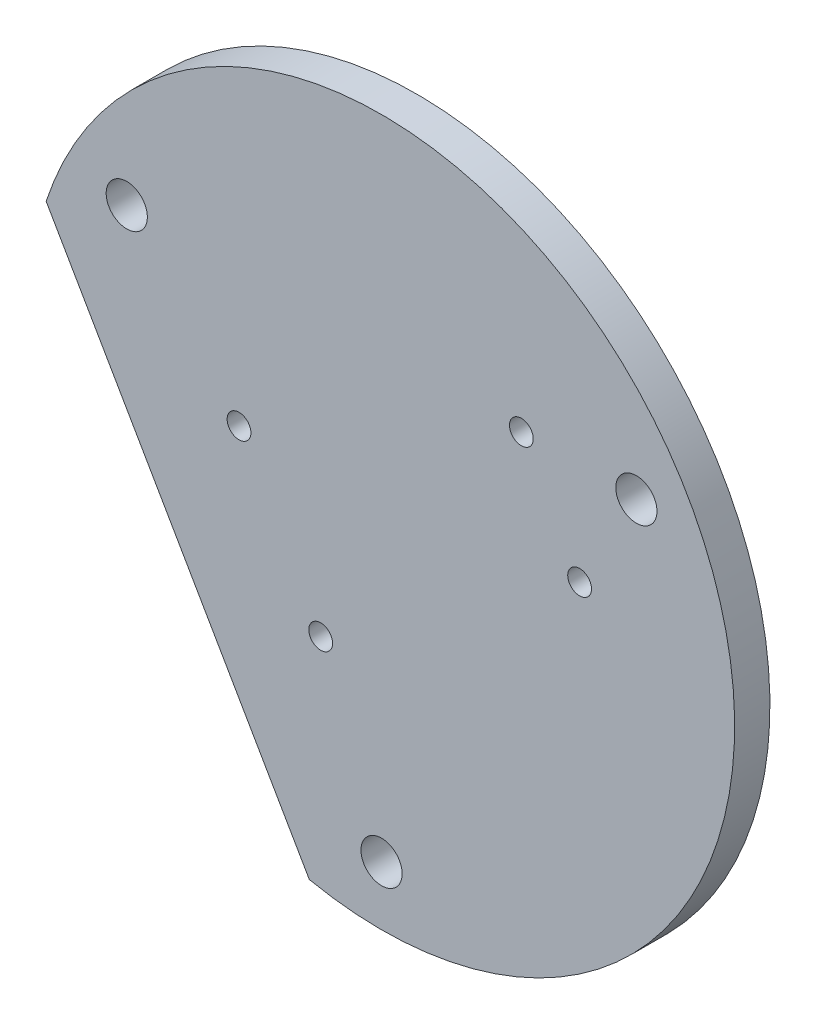
ISO-10303-21;
HEADER;
FILE_DESCRIPTION(('STEP AP214'),'2;1');
FILE_NAME('part.step','',(''),(''),'','','');
FILE_SCHEMA(('AUTOMOTIVE_DESIGN { 1 0 10303 214 1 1 1 1 }'));
ENDSEC;
DATA;
#1=APPLICATION_CONTEXT('core data for automotive mechanical design processes');
#2=APPLICATION_PROTOCOL_DEFINITION('international standard','automotive_design',2000,#1);
#3=PRODUCT_CONTEXT('',#1,'mechanical');
#4=PRODUCT('Part','Part','',(#3));
#5=PRODUCT_RELATED_PRODUCT_CATEGORY('part','',(#4));
#6=PRODUCT_DEFINITION_FORMATION('','',#4);
#7=PRODUCT_DEFINITION_CONTEXT('part definition',#1,'design');
#8=PRODUCT_DEFINITION('design','',#6,#7);
#9=PRODUCT_DEFINITION_SHAPE('','',#8);
#10=(LENGTH_UNIT() NAMED_UNIT(*) SI_UNIT(.MILLI.,.METRE.));
#11=(NAMED_UNIT(*) PLANE_ANGLE_UNIT() SI_UNIT($,.RADIAN.));
#12=(NAMED_UNIT(*) SI_UNIT($,.STERADIAN.) SOLID_ANGLE_UNIT());
#13=UNCERTAINTY_MEASURE_WITH_UNIT(LENGTH_MEASURE(1.E-05),#10,'distance_accuracy_value','');
#14=(GEOMETRIC_REPRESENTATION_CONTEXT(3) GLOBAL_UNCERTAINTY_ASSIGNED_CONTEXT((#13)) GLOBAL_UNIT_ASSIGNED_CONTEXT((#10,
#11,#12)) REPRESENTATION_CONTEXT('',''));
#15=CARTESIAN_POINT('',(0.,0.,0.));
#16=DIRECTION('',(0.,0.,1.));
#17=DIRECTION('',(1.,0.,0.));
#18=AXIS2_PLACEMENT_3D('',#15,#16,#17);
#19=CARTESIAN_POINT('',(-1169.13429510899,-675.,0.));
#20=DIRECTION('',(0.,0.,1.));
#21=DIRECTION('',(0.866025403784439,0.5,0.));
#22=AXIS2_PLACEMENT_3D('',#19,#20,#21);
#23=CYLINDRICAL_SURFACE('',#22,150.);
#24=DIRECTION('',(0.,0.,1.));
#25=VECTOR('',#24,1.);
#26=CARTESIAN_POINT('',(-1311.63853492493,-628.175416344815,0.));
#27=LINE('',#26,#25);
#28=CARTESIAN_POINT('',(-1311.63853492493,-628.175416344814,0.));
#29=VERTEX_POINT('',#28);
#30=CARTESIAN_POINT('',(-1311.63853492493,-628.175416344814,15.));
#31=VERTEX_POINT('',#30);
#32=EDGE_CURVE('E154',#29,#31,#27,.T.);
#33=ORIENTED_EDGE('',*,*,#32,.T.);
#34=CARTESIAN_POINT('',(-1169.13429510899,-675.,15.));
#35=DIRECTION('',(0.,0.,-1.));
#36=DIRECTION('',(-1.,0.,0.));
#37=AXIS2_PLACEMENT_3D('',#34,#35,#36);
#38=CIRCLE('',#37,150.);
#39=CARTESIAN_POINT('',(-1199.83513604994,-821.824583655185,15.));
#40=VERTEX_POINT('',#39);
#41=EDGE_CURVE('E28',#31,#40,#38,.T.);
#42=ORIENTED_EDGE('',*,*,#41,.T.);
#43=DIRECTION('',(0.,0.,-1.));
#44=VECTOR('',#43,1.);
#45=CARTESIAN_POINT('',(-1199.83513604994,-821.824583655185,15.));
#46=LINE('',#45,#44);
#47=CARTESIAN_POINT('',(-1199.83513604994,-821.824583655185,0.));
#48=VERTEX_POINT('',#47);
#49=EDGE_CURVE('E153',#40,#48,#46,.T.);
#50=ORIENTED_EDGE('',*,*,#49,.T.);
#51=CARTESIAN_POINT('',(-1169.13429510899,-675.,0.));
#52=DIRECTION('',(0.,0.,-1.));
#53=DIRECTION('',(-1.,0.,0.));
#54=AXIS2_PLACEMENT_3D('',#51,#52,#53);
#55=CIRCLE('',#54,150.);
#56=EDGE_CURVE('E11',#29,#48,#55,.T.);
#57=ORIENTED_EDGE('',*,*,#56,.F.);
#58=EDGE_LOOP('',(#33,#42,#50,#57));
#59=FACE_BOUND('',#58,.T.);
#60=ADVANCED_FACE('F17',(#59),#23,.T.);
#61=CARTESIAN_POINT('',(-1169.13429510899,-675.,0.));
#62=DIRECTION('',(0.,0.,-1.));
#63=DIRECTION('',(0.,-1.,0.));
#64=AXIS2_PLACEMENT_3D('',#61,#62,#63);
#65=PLANE('',#64);
#66=CARTESIAN_POINT('',(-1060.88111963594,-612.5,0.));
#67=DIRECTION('',(0.,0.,1.));
#68=DIRECTION('',(-1.,0.,0.));
#69=AXIS2_PLACEMENT_3D('',#66,#67,#68);
#70=CIRCLE('',#69,8.75);
#71=CARTESIAN_POINT('',(-1052.13111963594,-612.5,0.));
#72=VERTEX_POINT('',#71);
#73=EDGE_CURVE('E155',#72,#72,#70,.T.);
#74=ORIENTED_EDGE('',*,*,#73,.T.);
#75=EDGE_LOOP('',(#74));
#76=FACE_BOUND('',#75,.T.);
#77=CARTESIAN_POINT('',(-1277.38747058205,-612.5,0.));
#78=DIRECTION('',(0.,0.,1.));
#79=DIRECTION('',(0.5,-0.866025403784439,0.));
#80=AXIS2_PLACEMENT_3D('',#77,#78,#79);
#81=CIRCLE('',#80,8.75);
#82=CARTESIAN_POINT('',(-1281.76247058205,-604.922277716886,0.));
#83=VERTEX_POINT('',#82);
#84=EDGE_CURVE('E148',#83,#83,#81,.T.);
#85=ORIENTED_EDGE('',*,*,#84,.T.);
#86=EDGE_LOOP('',(#85));
#87=FACE_BOUND('',#86,.T.);
#88=CARTESIAN_POINT('',(-1169.13429510899,-800.,0.));
#89=DIRECTION('',(0.,0.,1.));
#90=DIRECTION('',(0.5,0.866025403784439,0.));
#91=AXIS2_PLACEMENT_3D('',#88,#89,#90);
#92=CIRCLE('',#91,8.75);
#93=CARTESIAN_POINT('',(-1173.50929510899,-807.577722283114,0.));
#94=VERTEX_POINT('',#93);
#95=EDGE_CURVE('E167',#94,#94,#92,.T.);
#96=ORIENTED_EDGE('',*,*,#95,.T.);
#97=EDGE_LOOP('',(#96));
#98=FACE_BOUND('',#97,.T.);
#99=CARTESIAN_POINT('',(-1109.74663947881,-612.137563106116,0.));
#100=DIRECTION('',(0.,0.,1.));
#101=DIRECTION('',(-1.,0.,0.));
#102=AXIS2_PLACEMENT_3D('',#99,#100,#101);
#103=CIRCLE('',#102,5.053);
#104=CARTESIAN_POINT('',(-1104.69363947881,-612.137563106116,0.));
#105=VERTEX_POINT('',#104);
#106=EDGE_CURVE('E59',#105,#105,#103,.T.);
#107=ORIENTED_EDGE('',*,*,#106,.T.);
#108=EDGE_LOOP('',(#107));
#109=FACE_BOUND('',#108,.T.);
#110=CARTESIAN_POINT('',(-1229.69854476264,-669.900357522404,0.));
#111=DIRECTION('',(0.,0.,1.));
#112=DIRECTION('',(-1.,0.,0.));
#113=AXIS2_PLACEMENT_3D('',#110,#111,#112);
#114=CIRCLE('',#113,5.053);
#115=CARTESIAN_POINT('',(-1224.64554476264,-669.900357522404,0.));
#116=VERTEX_POINT('',#115);
#117=EDGE_CURVE('E142',#116,#116,#114,.T.);
#118=ORIENTED_EDGE('',*,*,#117,.T.);
#119=EDGE_LOOP('',(#118));
#120=FACE_BOUND('',#119,.T.);
#121=CARTESIAN_POINT('',(-1195.,-730.,0.));
#122=DIRECTION('',(0.,0.,1.));
#123=DIRECTION('',(-1.,0.,0.));
#124=AXIS2_PLACEMENT_3D('',#121,#122,#123);
#125=CIRCLE('',#124,5.053);
#126=CARTESIAN_POINT('',(-1189.947,-730.,0.));
#127=VERTEX_POINT('',#126);
#128=EDGE_CURVE('E127',#127,#127,#125,.T.);
#129=ORIENTED_EDGE('',*,*,#128,.T.);
#130=EDGE_LOOP('',(#129));
#131=FACE_BOUND('',#130,.T.);
#132=CARTESIAN_POINT('',(-1085.,-655.,0.));
#133=DIRECTION('',(0.,0.,1.));
#134=DIRECTION('',(-1.,0.,0.));
#135=AXIS2_PLACEMENT_3D('',#132,#133,#134);
#136=CIRCLE('',#135,5.053);
#137=CARTESIAN_POINT('',(-1079.947,-655.,0.));
#138=VERTEX_POINT('',#137);
#139=EDGE_CURVE('E115',#138,#138,#136,.T.);
#140=ORIENTED_EDGE('',*,*,#139,.T.);
#141=EDGE_LOOP('',(#140));
#142=FACE_BOUND('',#141,.T.);
#143=DIRECTION('',(-0.5,0.866025403784439,0.));
#144=VECTOR('',#143,1.);
#145=CARTESIAN_POINT('',(-1199.83513604994,-821.824583655185,0.));
#146=LINE('',#145,#144);
#147=EDGE_CURVE('E150',#48,#29,#146,.T.);
#148=ORIENTED_EDGE('',*,*,#147,.T.);
#149=ORIENTED_EDGE('',*,*,#56,.T.);
#150=EDGE_LOOP('',(#148,#149));
#151=FACE_BOUND('',#150,.T.);
#152=ADVANCED_FACE('F230',(#76,#87,#98,#109,#120,#131,#142,#151),#65,.T.);
#153=CARTESIAN_POINT('',(-1169.13429510899,-675.,15.));
#154=DIRECTION('',(0.,0.,-1.));
#155=DIRECTION('',(0.,-1.,0.));
#156=AXIS2_PLACEMENT_3D('',#153,#154,#155);
#157=PLANE('',#156);
#158=CARTESIAN_POINT('',(-1060.88111963594,-612.5,15.));
#159=DIRECTION('',(0.,0.,-1.));
#160=DIRECTION('',(-1.,0.,0.));
#161=AXIS2_PLACEMENT_3D('',#158,#159,#160);
#162=CIRCLE('',#161,8.75);
#163=CARTESIAN_POINT('',(-1052.13111963594,-612.5,15.));
#164=VERTEX_POINT('',#163);
#165=EDGE_CURVE('E162',#164,#164,#162,.T.);
#166=ORIENTED_EDGE('',*,*,#165,.T.);
#167=EDGE_LOOP('',(#166));
#168=FACE_BOUND('',#167,.T.);
#169=CARTESIAN_POINT('',(-1277.38747058205,-612.5,15.));
#170=DIRECTION('',(0.,0.,-1.));
#171=DIRECTION('',(0.5,-0.866025403784439,0.));
#172=AXIS2_PLACEMENT_3D('',#169,#170,#171);
#173=CIRCLE('',#172,8.75);
#174=CARTESIAN_POINT('',(-1281.76247058205,-604.922277716886,15.));
#175=VERTEX_POINT('',#174);
#176=EDGE_CURVE('E149',#175,#175,#173,.T.);
#177=ORIENTED_EDGE('',*,*,#176,.T.);
#178=EDGE_LOOP('',(#177));
#179=FACE_BOUND('',#178,.T.);
#180=CARTESIAN_POINT('',(-1169.13429510899,-800.,15.));
#181=DIRECTION('',(0.,0.,-1.));
#182=DIRECTION('',(0.5,0.866025403784439,0.));
#183=AXIS2_PLACEMENT_3D('',#180,#181,#182);
#184=CIRCLE('',#183,8.75);
#185=CARTESIAN_POINT('',(-1173.50929510899,-807.577722283114,15.));
#186=VERTEX_POINT('',#185);
#187=EDGE_CURVE('E168',#186,#186,#184,.T.);
#188=ORIENTED_EDGE('',*,*,#187,.T.);
#189=EDGE_LOOP('',(#188));
#190=FACE_BOUND('',#189,.T.);
#191=CARTESIAN_POINT('',(-1109.74663947881,-612.137563106116,15.));
#192=DIRECTION('',(0.,0.,-1.));
#193=DIRECTION('',(-1.,0.,0.));
#194=AXIS2_PLACEMENT_3D('',#191,#192,#193);
#195=CIRCLE('',#194,5.053);
#196=CARTESIAN_POINT('',(-1104.69363947881,-612.137563106116,15.));
#197=VERTEX_POINT('',#196);
#198=EDGE_CURVE('E172',#197,#197,#195,.T.);
#199=ORIENTED_EDGE('',*,*,#198,.T.);
#200=EDGE_LOOP('',(#199));
#201=FACE_BOUND('',#200,.T.);
#202=CARTESIAN_POINT('',(-1229.69854476264,-669.900357522404,15.));
#203=DIRECTION('',(0.,0.,-1.));
#204=DIRECTION('',(-1.,0.,0.));
#205=AXIS2_PLACEMENT_3D('',#202,#203,#204);
#206=CIRCLE('',#205,5.053);
#207=CARTESIAN_POINT('',(-1224.64554476264,-669.900357522404,15.));
#208=VERTEX_POINT('',#207);
#209=EDGE_CURVE('E196',#208,#208,#206,.T.);
#210=ORIENTED_EDGE('',*,*,#209,.T.);
#211=EDGE_LOOP('',(#210));
#212=FACE_BOUND('',#211,.T.);
#213=CARTESIAN_POINT('',(-1195.,-730.,15.));
#214=DIRECTION('',(0.,0.,-1.));
#215=DIRECTION('',(-1.,0.,0.));
#216=AXIS2_PLACEMENT_3D('',#213,#214,#215);
#217=CIRCLE('',#216,5.053);
#218=CARTESIAN_POINT('',(-1189.947,-730.,15.));
#219=VERTEX_POINT('',#218);
#220=EDGE_CURVE('E126',#219,#219,#217,.T.);
#221=ORIENTED_EDGE('',*,*,#220,.T.);
#222=EDGE_LOOP('',(#221));
#223=FACE_BOUND('',#222,.T.);
#224=CARTESIAN_POINT('',(-1085.,-655.,15.));
#225=DIRECTION('',(0.,0.,-1.));
#226=DIRECTION('',(-1.,0.,0.));
#227=AXIS2_PLACEMENT_3D('',#224,#225,#226);
#228=CIRCLE('',#227,5.053);
#229=CARTESIAN_POINT('',(-1079.947,-655.,15.));
#230=VERTEX_POINT('',#229);
#231=EDGE_CURVE('E169',#230,#230,#228,.T.);
#232=ORIENTED_EDGE('',*,*,#231,.T.);
#233=EDGE_LOOP('',(#232));
#234=FACE_BOUND('',#233,.T.);
#235=DIRECTION('',(0.5,-0.866025403784439,0.));
#236=VECTOR('',#235,1.);
#237=CARTESIAN_POINT('',(-1311.63853492493,-628.175416344814,15.));
#238=LINE('',#237,#236);
#239=EDGE_CURVE('E158',#31,#40,#238,.T.);
#240=ORIENTED_EDGE('',*,*,#239,.T.);
#241=ORIENTED_EDGE('',*,*,#41,.F.);
#242=EDGE_LOOP('',(#240,#241));
#243=FACE_BOUND('',#242,.T.);
#244=ADVANCED_FACE('F131',(#168,#179,#190,#201,#212,#223,#234,#243),#157,.F.);
#245=CARTESIAN_POINT('',(-1311.63853492493,-628.175416344814,0.));
#246=DIRECTION('',(0.866025403784439,0.5,0.));
#247=DIRECTION('',(0.,0.,-1.));
#248=AXIS2_PLACEMENT_3D('',#245,#246,#247);
#249=PLANE('',#248);
#250=ORIENTED_EDGE('',*,*,#239,.F.);
#251=ORIENTED_EDGE('',*,*,#32,.F.);
#252=ORIENTED_EDGE('',*,*,#147,.F.);
#253=ORIENTED_EDGE('',*,*,#49,.F.);
#254=EDGE_LOOP('',(#250,#251,#252,#253));
#255=FACE_BOUND('',#254,.T.);
#256=ADVANCED_FACE('F240',(#255),#249,.F.);
#257=CARTESIAN_POINT('',(-1060.88111963594,-612.5,419.265703713409));
#258=DIRECTION('',(0.,0.,-1.));
#259=DIRECTION('',(-1.,0.,0.));
#260=AXIS2_PLACEMENT_3D('',#257,#258,#259);
#261=CYLINDRICAL_SURFACE('',#260,8.75);
#262=ORIENTED_EDGE('',*,*,#165,.F.);
#263=DIRECTION('',(0.,0.,-1.));
#264=VECTOR('',#263,1.);
#265=CARTESIAN_POINT('',(-1052.13111963594,-612.5,419.265703713409));
#266=LINE('',#265,#264);
#267=EDGE_CURVE('E159',#164,#72,#266,.T.);
#268=ORIENTED_EDGE('',*,*,#267,.T.);
#269=ORIENTED_EDGE('',*,*,#73,.F.);
#270=ORIENTED_EDGE('',*,*,#267,.F.);
#271=EDGE_LOOP('',(#262,#268,#269,#270));
#272=FACE_BOUND('',#271,.T.);
#273=ADVANCED_FACE('F366',(#272),#261,.F.);
#274=CARTESIAN_POINT('',(-1277.38747058205,-612.5,419.265703713409));
#275=DIRECTION('',(0.,0.,-1.));
#276=DIRECTION('',(0.5,-0.866025403784439,0.));
#277=AXIS2_PLACEMENT_3D('',#274,#275,#276);
#278=CYLINDRICAL_SURFACE('',#277,8.75);
#279=ORIENTED_EDGE('',*,*,#176,.F.);
#280=DIRECTION('',(0.,0.,-1.));
#281=VECTOR('',#280,1.);
#282=CARTESIAN_POINT('',(-1281.76247058205,-604.922277716886,419.265703713409));
#283=LINE('',#282,#281);
#284=EDGE_CURVE('E144',#175,#83,#283,.T.);
#285=ORIENTED_EDGE('',*,*,#284,.T.);
#286=ORIENTED_EDGE('',*,*,#84,.F.);
#287=ORIENTED_EDGE('',*,*,#284,.F.);
#288=EDGE_LOOP('',(#279,#285,#286,#287));
#289=FACE_BOUND('',#288,.T.);
#290=ADVANCED_FACE('F19',(#289),#278,.F.);
#291=CARTESIAN_POINT('',(-1169.13429510899,-800.,419.265703713409));
#292=DIRECTION('',(0.,0.,-1.));
#293=DIRECTION('',(0.5,0.866025403784439,0.));
#294=AXIS2_PLACEMENT_3D('',#291,#292,#293);
#295=CYLINDRICAL_SURFACE('',#294,8.75);
#296=ORIENTED_EDGE('',*,*,#187,.F.);
#297=DIRECTION('',(0.,0.,-1.));
#298=VECTOR('',#297,1.);
#299=CARTESIAN_POINT('',(-1173.50929510899,-807.577722283114,419.265703713409));
#300=LINE('',#299,#298);
#301=EDGE_CURVE('E163',#186,#94,#300,.T.);
#302=ORIENTED_EDGE('',*,*,#301,.T.);
#303=ORIENTED_EDGE('',*,*,#95,.F.);
#304=ORIENTED_EDGE('',*,*,#301,.F.);
#305=EDGE_LOOP('',(#296,#302,#303,#304));
#306=FACE_BOUND('',#305,.T.);
#307=ADVANCED_FACE('F227',(#306),#295,.F.);
#308=CARTESIAN_POINT('',(-1109.74663947881,-612.137563106116,419.265703713409));
#309=DIRECTION('',(0.,0.,-1.));
#310=DIRECTION('',(-1.,0.,0.));
#311=AXIS2_PLACEMENT_3D('',#308,#309,#310);
#312=CYLINDRICAL_SURFACE('',#311,5.053);
#313=ORIENTED_EDGE('',*,*,#198,.F.);
#314=DIRECTION('',(0.,0.,-1.));
#315=VECTOR('',#314,1.);
#316=CARTESIAN_POINT('',(-1104.69363947881,-612.137563106116,419.265703713409));
#317=LINE('',#316,#315);
#318=EDGE_CURVE('E73',#197,#105,#317,.T.);
#319=ORIENTED_EDGE('',*,*,#318,.T.);
#320=ORIENTED_EDGE('',*,*,#106,.F.);
#321=ORIENTED_EDGE('',*,*,#318,.F.);
#322=EDGE_LOOP('',(#313,#319,#320,#321));
#323=FACE_BOUND('',#322,.T.);
#324=ADVANCED_FACE('F248',(#323),#312,.F.);
#325=CARTESIAN_POINT('',(-1229.69854476264,-669.900357522404,419.265703713409));
#326=DIRECTION('',(0.,0.,-1.));
#327=DIRECTION('',(-1.,0.,0.));
#328=AXIS2_PLACEMENT_3D('',#325,#326,#327);
#329=CYLINDRICAL_SURFACE('',#328,5.053);
#330=ORIENTED_EDGE('',*,*,#209,.F.);
#331=DIRECTION('',(0.,0.,-1.));
#332=VECTOR('',#331,1.);
#333=CARTESIAN_POINT('',(-1224.64554476264,-669.900357522404,419.265703713409));
#334=LINE('',#333,#332);
#335=EDGE_CURVE('E21',#208,#116,#334,.T.);
#336=ORIENTED_EDGE('',*,*,#335,.T.);
#337=ORIENTED_EDGE('',*,*,#117,.F.);
#338=ORIENTED_EDGE('',*,*,#335,.F.);
#339=EDGE_LOOP('',(#330,#336,#337,#338));
#340=FACE_BOUND('',#339,.T.);
#341=ADVANCED_FACE('F250',(#340),#329,.F.);
#342=CARTESIAN_POINT('',(-1195.,-730.,419.265703713409));
#343=DIRECTION('',(0.,0.,-1.));
#344=DIRECTION('',(-1.,0.,0.));
#345=AXIS2_PLACEMENT_3D('',#342,#343,#344);
#346=CYLINDRICAL_SURFACE('',#345,5.053);
#347=ORIENTED_EDGE('',*,*,#220,.F.);
#348=DIRECTION('',(0.,0.,-1.));
#349=VECTOR('',#348,1.);
#350=CARTESIAN_POINT('',(-1189.947,-730.,419.265703713409));
#351=LINE('',#350,#349);
#352=EDGE_CURVE('E123',#219,#127,#351,.T.);
#353=ORIENTED_EDGE('',*,*,#352,.T.);
#354=ORIENTED_EDGE('',*,*,#128,.F.);
#355=ORIENTED_EDGE('',*,*,#352,.F.);
#356=EDGE_LOOP('',(#347,#353,#354,#355));
#357=FACE_BOUND('',#356,.T.);
#358=ADVANCED_FACE('F125',(#357),#346,.F.);
#359=CARTESIAN_POINT('',(-1085.,-655.,419.265703713409));
#360=DIRECTION('',(0.,0.,-1.));
#361=DIRECTION('',(-1.,0.,0.));
#362=AXIS2_PLACEMENT_3D('',#359,#360,#361);
#363=CYLINDRICAL_SURFACE('',#362,5.053);
#364=ORIENTED_EDGE('',*,*,#231,.F.);
#365=DIRECTION('',(0.,0.,-1.));
#366=VECTOR('',#365,1.);
#367=CARTESIAN_POINT('',(-1079.947,-655.,419.265703713409));
#368=LINE('',#367,#366);
#369=EDGE_CURVE('E110',#230,#138,#368,.T.);
#370=ORIENTED_EDGE('',*,*,#369,.T.);
#371=ORIENTED_EDGE('',*,*,#139,.F.);
#372=ORIENTED_EDGE('',*,*,#369,.F.);
#373=EDGE_LOOP('',(#364,#370,#371,#372));
#374=FACE_BOUND('',#373,.T.);
#375=ADVANCED_FACE('F345',(#374),#363,.F.);
#376=CLOSED_SHELL('',(#60,#152,#244,#256,#273,#290,#307,#324,#341,#358,#375));
#377=MANIFOLD_SOLID_BREP('B1',#376);
#378=ADVANCED_BREP_SHAPE_REPRESENTATION('',(#18,#377),#14);
#379=SHAPE_DEFINITION_REPRESENTATION(#9,#378);
ENDSEC;
END-ISO-10303-21;
